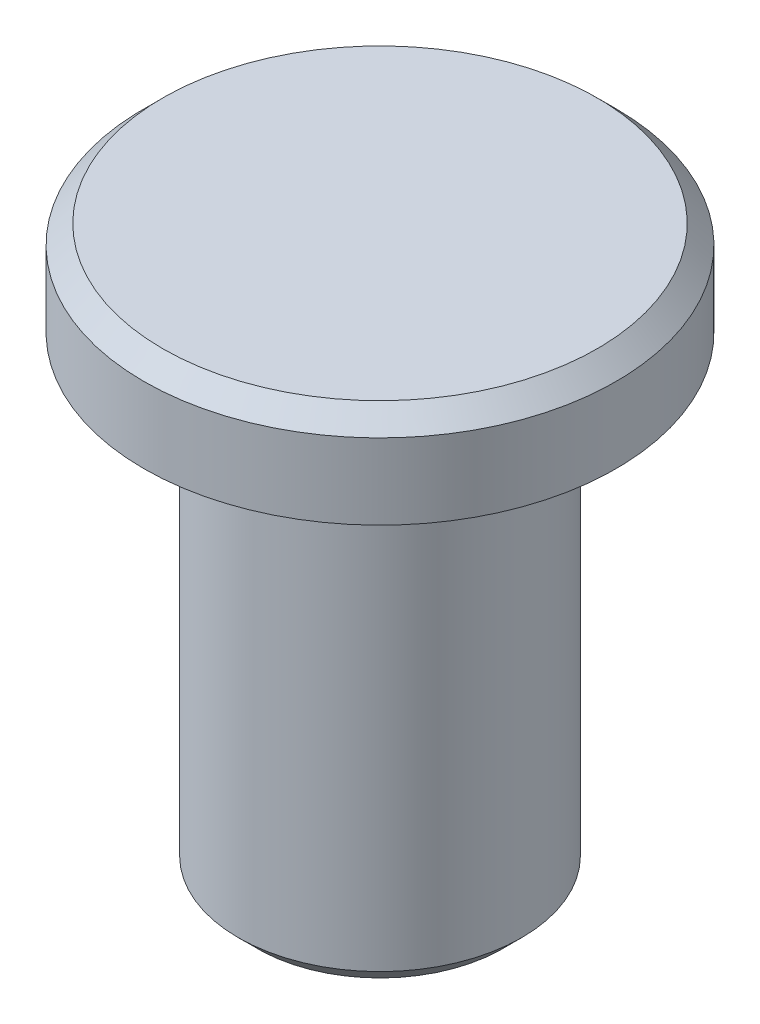
ISO-10303-21;
HEADER;
FILE_DESCRIPTION(('STEP AP214'),'2;1');
FILE_NAME('part.step','',(''),(''),'','','');
FILE_SCHEMA(('AUTOMOTIVE_DESIGN { 1 0 10303 214 1 1 1 1 }'));
ENDSEC;
DATA;
#1=APPLICATION_CONTEXT('core data for automotive mechanical design processes');
#2=APPLICATION_PROTOCOL_DEFINITION('international standard','automotive_design',2000,#1);
#3=PRODUCT_CONTEXT('',#1,'mechanical');
#4=PRODUCT('Part','Part','',(#3));
#5=PRODUCT_RELATED_PRODUCT_CATEGORY('part','',(#4));
#6=PRODUCT_DEFINITION_FORMATION('','',#4);
#7=PRODUCT_DEFINITION_CONTEXT('part definition',#1,'design');
#8=PRODUCT_DEFINITION('design','',#6,#7);
#9=PRODUCT_DEFINITION_SHAPE('','',#8);
#10=(LENGTH_UNIT() NAMED_UNIT(*) SI_UNIT(.MILLI.,.METRE.));
#11=(NAMED_UNIT(*) PLANE_ANGLE_UNIT() SI_UNIT($,.RADIAN.));
#12=(NAMED_UNIT(*) SI_UNIT($,.STERADIAN.) SOLID_ANGLE_UNIT());
#13=UNCERTAINTY_MEASURE_WITH_UNIT(LENGTH_MEASURE(1.E-05),#10,'distance_accuracy_value','');
#14=(GEOMETRIC_REPRESENTATION_CONTEXT(3) GLOBAL_UNCERTAINTY_ASSIGNED_CONTEXT((#13)) GLOBAL_UNIT_ASSIGNED_CONTEXT((#10,
#11,#12)) REPRESENTATION_CONTEXT('',''));
#15=CARTESIAN_POINT('',(0.,0.,0.));
#16=DIRECTION('',(0.,0.,1.));
#17=DIRECTION('',(1.,0.,0.));
#18=AXIS2_PLACEMENT_3D('',#15,#16,#17);
#19=CARTESIAN_POINT('',(1.5,0.,0.));
#20=DIRECTION('',(0.,-1.,0.));
#21=DIRECTION('',(0.,0.,-1.));
#22=AXIS2_PLACEMENT_3D('',#19,#20,#21);
#23=PLANE('',#22);
#24=CARTESIAN_POINT('',(0.,0.,0.));
#25=DIRECTION('',(0.,-1.,0.));
#26=DIRECTION('',(0.,0.,-1.));
#27=AXIS2_PLACEMENT_3D('',#24,#25,#26);
#28=CIRCLE('',#27,1.3);
#29=CARTESIAN_POINT('',(0.,0.,-1.3));
#30=VERTEX_POINT('',#29);
#31=EDGE_CURVE('E49',#30,#30,#28,.T.);
#32=ORIENTED_EDGE('',*,*,#31,.T.);
#33=EDGE_LOOP('',(#32));
#34=FACE_BOUND('',#33,.T.);
#35=ADVANCED_FACE('F33',(#34),#23,.T.);
#36=CARTESIAN_POINT('',(0.,6.,0.));
#37=DIRECTION('',(0.,1.,0.));
#38=DIRECTION('',(0.,0.,1.));
#39=AXIS2_PLACEMENT_3D('',#36,#37,#38);
#40=PLANE('',#39);
#41=CARTESIAN_POINT('',(0.,6.,0.));
#42=DIRECTION('',(0.,1.,0.));
#43=DIRECTION('',(0.,0.,1.));
#44=AXIS2_PLACEMENT_3D('',#41,#42,#43);
#45=CIRCLE('',#44,2.3);
#46=CARTESIAN_POINT('',(0.,6.,2.3));
#47=VERTEX_POINT('',#46);
#48=EDGE_CURVE('E10',#47,#47,#45,.T.);
#49=ORIENTED_EDGE('',*,*,#48,.T.);
#50=EDGE_LOOP('',(#49));
#51=FACE_BOUND('',#50,.T.);
#52=ADVANCED_FACE('F75',(#51),#40,.T.);
#53=CARTESIAN_POINT('',(0.,0.,0.));
#54=DIRECTION('',(0.,-1.,0.));
#55=DIRECTION('',(0.,0.,-1.));
#56=AXIS2_PLACEMENT_3D('',#53,#54,#55);
#57=CYLINDRICAL_SURFACE('',#56,2.5);
#58=CARTESIAN_POINT('',(0.,5.8,0.));
#59=DIRECTION('',(0.,1.,0.));
#60=DIRECTION('',(0.,0.,1.));
#61=AXIS2_PLACEMENT_3D('',#58,#59,#60);
#62=CIRCLE('',#61,2.5);
#63=CARTESIAN_POINT('',(0.,5.8,2.5));
#64=VERTEX_POINT('',#63);
#65=EDGE_CURVE('E41',#64,#64,#62,.F.);
#66=ORIENTED_EDGE('',*,*,#65,.T.);
#67=EDGE_LOOP('',(#66));
#68=FACE_BOUND('',#67,.T.);
#69=CARTESIAN_POINT('',(0.,5.,0.));
#70=DIRECTION('',(0.,-1.,0.));
#71=DIRECTION('',(0.,0.,-1.));
#72=AXIS2_PLACEMENT_3D('',#69,#70,#71);
#73=CIRCLE('',#72,2.5);
#74=CARTESIAN_POINT('',(0.,5.,-2.5));
#75=VERTEX_POINT('',#74);
#76=EDGE_CURVE('E54',#75,#75,#73,.T.);
#77=ORIENTED_EDGE('',*,*,#76,.F.);
#78=EDGE_LOOP('',(#77));
#79=FACE_BOUND('',#78,.T.);
#80=ADVANCED_FACE('F65',(#68,#79),#57,.T.);
#81=CARTESIAN_POINT('',(2.5,5.,0.));
#82=DIRECTION('',(0.,-1.,0.));
#83=DIRECTION('',(0.,0.,-1.));
#84=AXIS2_PLACEMENT_3D('',#81,#82,#83);
#85=PLANE('',#84);
#86=ORIENTED_EDGE('',*,*,#76,.T.);
#87=EDGE_LOOP('',(#86));
#88=FACE_BOUND('',#87,.T.);
#89=CARTESIAN_POINT('',(0.,5.,0.));
#90=DIRECTION('',(0.,-1.,0.));
#91=DIRECTION('',(0.,0.,-1.));
#92=AXIS2_PLACEMENT_3D('',#89,#90,#91);
#93=CIRCLE('',#92,1.5);
#94=CARTESIAN_POINT('',(0.,5.,-1.5));
#95=VERTEX_POINT('',#94);
#96=EDGE_CURVE('E57',#95,#95,#93,.T.);
#97=ORIENTED_EDGE('',*,*,#96,.F.);
#98=EDGE_LOOP('',(#97));
#99=FACE_BOUND('',#98,.T.);
#100=ADVANCED_FACE('F63',(#88,#99),#85,.T.);
#101=CARTESIAN_POINT('',(0.,0.,0.));
#102=DIRECTION('',(0.,-1.,0.));
#103=DIRECTION('',(0.,0.,-1.));
#104=AXIS2_PLACEMENT_3D('',#101,#102,#103);
#105=CYLINDRICAL_SURFACE('',#104,1.5);
#106=CARTESIAN_POINT('',(0.,0.199999999999998,0.));
#107=DIRECTION('',(0.,-1.,0.));
#108=DIRECTION('',(0.,0.,-1.));
#109=AXIS2_PLACEMENT_3D('',#106,#107,#108);
#110=CIRCLE('',#109,1.5);
#111=CARTESIAN_POINT('',(0.,0.199999999999998,-1.5));
#112=VERTEX_POINT('',#111);
#113=EDGE_CURVE('E45',#112,#112,#110,.F.);
#114=ORIENTED_EDGE('',*,*,#113,.T.);
#115=EDGE_LOOP('',(#114));
#116=FACE_BOUND('',#115,.T.);
#117=ORIENTED_EDGE('',*,*,#96,.T.);
#118=EDGE_LOOP('',(#117));
#119=FACE_BOUND('',#118,.T.);
#120=ADVANCED_FACE('F61',(#116,#119),#105,.T.);
#121=CARTESIAN_POINT('',(0.,0.,0.));
#122=DIRECTION('',(0.,1.,0.));
#123=DIRECTION('',(0.,0.,1.));
#124=AXIS2_PLACEMENT_3D('',#121,#122,#123);
#125=CONICAL_SURFACE('',#124,1.3,0.785398163397445);
#126=ORIENTED_EDGE('',*,*,#113,.F.);
#127=EDGE_LOOP('',(#126));
#128=FACE_BOUND('',#127,.T.);
#129=ORIENTED_EDGE('',*,*,#31,.F.);
#130=EDGE_LOOP('',(#129));
#131=FACE_BOUND('',#130,.T.);
#132=ADVANCED_FACE('F72',(#128,#131),#125,.T.);
#133=CARTESIAN_POINT('',(0.,5.8,0.));
#134=DIRECTION('',(0.,-1.,0.));
#135=DIRECTION('',(0.,0.,-1.));
#136=AXIS2_PLACEMENT_3D('',#133,#134,#135);
#137=CONICAL_SURFACE('',#136,2.5,0.785398163397451);
#138=ORIENTED_EDGE('',*,*,#48,.F.);
#139=EDGE_LOOP('',(#138));
#140=FACE_BOUND('',#139,.T.);
#141=ORIENTED_EDGE('',*,*,#65,.F.);
#142=EDGE_LOOP('',(#141));
#143=FACE_BOUND('',#142,.T.);
#144=ADVANCED_FACE('F36',(#140,#143),#137,.T.);
#145=CLOSED_SHELL('',(#35,#52,#80,#100,#120,#132,#144));
#146=MANIFOLD_SOLID_BREP('B2',#145);
#147=ADVANCED_BREP_SHAPE_REPRESENTATION('',(#18,#146),#14);
#148=SHAPE_DEFINITION_REPRESENTATION(#9,#147);
ENDSEC;
END-ISO-10303-21;
